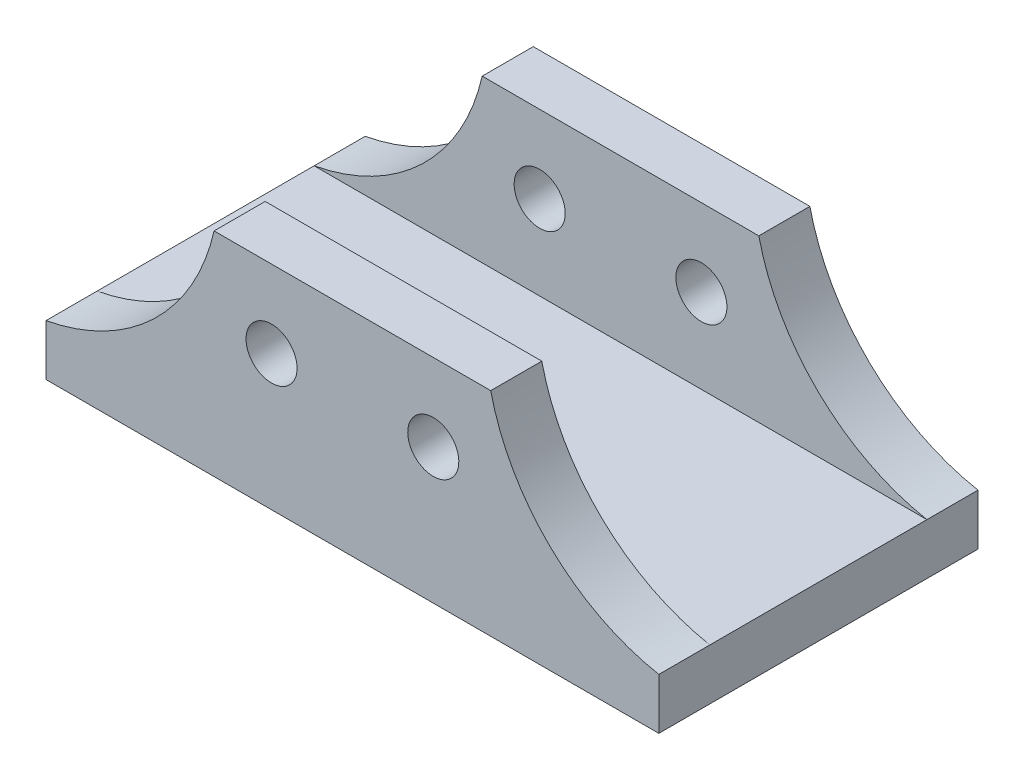
ISO-10303-21;
HEADER;
FILE_DESCRIPTION(('STEP AP214'),'2;1');
FILE_NAME('part.step','',(''),(''),'','','');
FILE_SCHEMA(('AUTOMOTIVE_DESIGN { 1 0 10303 214 1 1 1 1 }'));
ENDSEC;
DATA;
#1=APPLICATION_CONTEXT('core data for automotive mechanical design processes');
#2=APPLICATION_PROTOCOL_DEFINITION('international standard','automotive_design',2000,#1);
#3=PRODUCT_CONTEXT('',#1,'mechanical');
#4=PRODUCT('Part','Part','',(#3));
#5=PRODUCT_RELATED_PRODUCT_CATEGORY('part','',(#4));
#6=PRODUCT_DEFINITION_FORMATION('','',#4);
#7=PRODUCT_DEFINITION_CONTEXT('part definition',#1,'design');
#8=PRODUCT_DEFINITION('design','',#6,#7);
#9=PRODUCT_DEFINITION_SHAPE('','',#8);
#10=(LENGTH_UNIT() NAMED_UNIT(*) SI_UNIT(.MILLI.,.METRE.));
#11=(NAMED_UNIT(*) PLANE_ANGLE_UNIT() SI_UNIT($,.RADIAN.));
#12=(NAMED_UNIT(*) SI_UNIT($,.STERADIAN.) SOLID_ANGLE_UNIT());
#13=UNCERTAINTY_MEASURE_WITH_UNIT(LENGTH_MEASURE(1.E-05),#10,'distance_accuracy_value','');
#14=(GEOMETRIC_REPRESENTATION_CONTEXT(3) GLOBAL_UNCERTAINTY_ASSIGNED_CONTEXT((#13)) GLOBAL_UNIT_ASSIGNED_CONTEXT((#10,
#11,#12)) REPRESENTATION_CONTEXT('',''));
#15=CARTESIAN_POINT('',(0.,0.,0.));
#16=DIRECTION('',(0.,0.,1.));
#17=DIRECTION('',(1.,0.,0.));
#18=AXIS2_PLACEMENT_3D('',#15,#16,#17);
#19=CARTESIAN_POINT('',(81.2436376247931,61.1381233205086,-186.429513529052));
#20=DIRECTION('',(0.,0.,1.));
#21=DIRECTION('',(1.,0.,0.));
#22=AXIS2_PLACEMENT_3D('',#19,#20,#21);
#23=CYLINDRICAL_SURFACE('',#22,50.);
#24=CARTESIAN_POINT('',(81.2436376247931,61.1381233205086,25.5));
#25=DIRECTION('',(0.,0.,1.));
#26=DIRECTION('',(0.,-1.,0.));
#27=AXIS2_PLACEMENT_3D('',#24,#25,#26);
#28=CIRCLE('',#27,50.);
#29=CARTESIAN_POINT('',(32.4999999999999,50.,25.5));
#30=VERTEX_POINT('',#29);
#31=CARTESIAN_POINT('',(71.9999999999999,12.,25.5));
#32=VERTEX_POINT('',#31);
#33=EDGE_CURVE('E132',#30,#32,#28,.T.);
#34=ORIENTED_EDGE('',*,*,#33,.F.);
#35=DIRECTION('',(0.,0.,1.));
#36=VECTOR('',#35,1.);
#37=CARTESIAN_POINT('',(32.5,50.,-186.429513529052));
#38=LINE('',#37,#36);
#39=CARTESIAN_POINT('',(32.5,50.,37.5));
#40=VERTEX_POINT('',#39);
#41=EDGE_CURVE('E219',#30,#40,#38,.T.);
#42=ORIENTED_EDGE('',*,*,#41,.T.);
#43=CARTESIAN_POINT('',(81.2436376247931,61.1381233205086,37.5));
#44=DIRECTION('',(0.,0.,-1.));
#45=DIRECTION('',(-1.,0.,0.));
#46=AXIS2_PLACEMENT_3D('',#43,#44,#45);
#47=CIRCLE('',#46,50.);
#48=CARTESIAN_POINT('',(72.,12.,37.5));
#49=VERTEX_POINT('',#48);
#50=EDGE_CURVE('E213',#49,#40,#47,.T.);
#51=ORIENTED_EDGE('',*,*,#50,.F.);
#52=DIRECTION('',(0.,0.,-1.));
#53=VECTOR('',#52,1.);
#54=CARTESIAN_POINT('',(72.,12.,-37.5));
#55=LINE('',#54,#53);
#56=EDGE_CURVE('E151',#49,#32,#55,.T.);
#57=ORIENTED_EDGE('',*,*,#56,.T.);
#58=EDGE_LOOP('',(#34,#42,#51,#57));
#59=FACE_BOUND('',#58,.T.);
#60=ADVANCED_FACE('F33',(#59),#23,.F.);
#61=CARTESIAN_POINT('',(-32.5,50.,-186.429513529052));
#62=DIRECTION('',(0.,1.,0.));
#63=DIRECTION('',(-1.,0.,0.));
#64=AXIS2_PLACEMENT_3D('',#61,#62,#63);
#65=PLANE('',#64);
#66=DIRECTION('',(1.,0.,0.));
#67=VECTOR('',#66,1.);
#68=CARTESIAN_POINT('',(-96.,50.,25.5));
#69=LINE('',#68,#67);
#70=CARTESIAN_POINT('',(-32.5,50.,25.5));
#71=VERTEX_POINT('',#70);
#72=EDGE_CURVE('E177',#71,#30,#69,.T.);
#73=ORIENTED_EDGE('',*,*,#72,.F.);
#74=DIRECTION('',(0.,0.,1.));
#75=VECTOR('',#74,1.);
#76=CARTESIAN_POINT('',(-32.5,50.,-186.429513529052));
#77=LINE('',#76,#75);
#78=CARTESIAN_POINT('',(-32.5,50.,37.5));
#79=VERTEX_POINT('',#78);
#80=EDGE_CURVE('E221',#71,#79,#77,.T.);
#81=ORIENTED_EDGE('',*,*,#80,.T.);
#82=DIRECTION('',(-1.,0.,0.));
#83=VECTOR('',#82,1.);
#84=CARTESIAN_POINT('',(-32.5,50.,37.5));
#85=LINE('',#84,#83);
#86=EDGE_CURVE('E216',#40,#79,#85,.T.);
#87=ORIENTED_EDGE('',*,*,#86,.F.);
#88=ORIENTED_EDGE('',*,*,#41,.F.);
#89=EDGE_LOOP('',(#73,#81,#87,#88));
#90=FACE_BOUND('',#89,.T.);
#91=ADVANCED_FACE('F229',(#90),#65,.T.);
#92=CARTESIAN_POINT('',(-81.2436376247931,61.1381233205086,-186.429513529052));
#93=DIRECTION('',(0.,0.,1.));
#94=DIRECTION('',(1.,0.,0.));
#95=AXIS2_PLACEMENT_3D('',#92,#93,#94);
#96=CYLINDRICAL_SURFACE('',#95,50.);
#97=CARTESIAN_POINT('',(-81.2436376247931,61.1381233205086,25.5));
#98=DIRECTION('',(0.,0.,1.));
#99=DIRECTION('',(0.,-1.,0.));
#100=AXIS2_PLACEMENT_3D('',#97,#98,#99);
#101=CIRCLE('',#100,50.);
#102=CARTESIAN_POINT('',(-71.9999999999999,12.,25.5));
#103=VERTEX_POINT('',#102);
#104=EDGE_CURVE('E193',#103,#71,#101,.T.);
#105=ORIENTED_EDGE('',*,*,#104,.F.);
#106=DIRECTION('',(0.,0.,1.));
#107=VECTOR('',#106,1.);
#108=CARTESIAN_POINT('',(-72.,12.,-37.5));
#109=LINE('',#108,#107);
#110=CARTESIAN_POINT('',(-72.,12.,37.5));
#111=VERTEX_POINT('',#110);
#112=EDGE_CURVE('E59',#103,#111,#109,.T.);
#113=ORIENTED_EDGE('',*,*,#112,.T.);
#114=CARTESIAN_POINT('',(-81.2436376247931,61.1381233205086,37.5));
#115=DIRECTION('',(0.,0.,-1.));
#116=DIRECTION('',(1.,0.,0.));
#117=AXIS2_PLACEMENT_3D('',#114,#115,#116);
#118=CIRCLE('',#117,50.);
#119=EDGE_CURVE('E210',#79,#111,#118,.T.);
#120=ORIENTED_EDGE('',*,*,#119,.F.);
#121=ORIENTED_EDGE('',*,*,#80,.F.);
#122=EDGE_LOOP('',(#105,#113,#120,#121));
#123=FACE_BOUND('',#122,.T.);
#124=ADVANCED_FACE('F231',(#123),#96,.F.);
#125=CARTESIAN_POINT('',(-19.,31.7862398063653,-186.429513529052));
#126=DIRECTION('',(0.,0.,1.));
#127=DIRECTION('',(1.,0.,0.));
#128=AXIS2_PLACEMENT_3D('',#125,#126,#127);
#129=CYLINDRICAL_SURFACE('',#128,6.);
#130=CARTESIAN_POINT('',(-19.,31.7862398063653,25.5));
#131=DIRECTION('',(0.,0.,1.));
#132=DIRECTION('',(0.,-1.,0.));
#133=AXIS2_PLACEMENT_3D('',#130,#131,#132);
#134=CIRCLE('',#133,6.);
#135=CARTESIAN_POINT('',(-19.,25.7862398063653,25.5));
#136=VERTEX_POINT('',#135);
#137=EDGE_CURVE('E190',#136,#136,#134,.F.);
#138=ORIENTED_EDGE('',*,*,#137,.T.);
#139=EDGE_LOOP('',(#138));
#140=FACE_BOUND('',#139,.T.);
#141=CARTESIAN_POINT('',(-19.,31.7862398063653,37.5));
#142=DIRECTION('',(0.,0.,1.));
#143=DIRECTION('',(1.,0.,0.));
#144=AXIS2_PLACEMENT_3D('',#141,#142,#143);
#145=CIRCLE('',#144,6.);
#146=CARTESIAN_POINT('',(-13.,31.7862398063653,37.5));
#147=VERTEX_POINT('',#146);
#148=EDGE_CURVE('E207',#147,#147,#145,.T.);
#149=ORIENTED_EDGE('',*,*,#148,.T.);
#150=EDGE_LOOP('',(#149));
#151=FACE_BOUND('',#150,.T.);
#152=ADVANCED_FACE('F259',(#140,#151),#129,.F.);
#153=CARTESIAN_POINT('',(19.,31.7862398063653,-186.429513529052));
#154=DIRECTION('',(0.,0.,1.));
#155=DIRECTION('',(1.,0.,0.));
#156=AXIS2_PLACEMENT_3D('',#153,#154,#155);
#157=CYLINDRICAL_SURFACE('',#156,6.);
#158=CARTESIAN_POINT('',(19.,31.7862398063653,25.5));
#159=DIRECTION('',(0.,0.,1.));
#160=DIRECTION('',(0.,-1.,0.));
#161=AXIS2_PLACEMENT_3D('',#158,#159,#160);
#162=CIRCLE('',#161,6.);
#163=CARTESIAN_POINT('',(19.,25.7862398063653,25.5));
#164=VERTEX_POINT('',#163);
#165=EDGE_CURVE('E37',#164,#164,#162,.F.);
#166=ORIENTED_EDGE('',*,*,#165,.T.);
#167=EDGE_LOOP('',(#166));
#168=FACE_BOUND('',#167,.T.);
#169=CARTESIAN_POINT('',(19.,31.7862398063653,37.5));
#170=DIRECTION('',(0.,0.,1.));
#171=DIRECTION('',(-1.,0.,0.));
#172=AXIS2_PLACEMENT_3D('',#169,#170,#171);
#173=CIRCLE('',#172,6.);
#174=CARTESIAN_POINT('',(13.,31.7862398063653,37.5));
#175=VERTEX_POINT('',#174);
#176=EDGE_CURVE('E131',#175,#175,#173,.T.);
#177=ORIENTED_EDGE('',*,*,#176,.T.);
#178=EDGE_LOOP('',(#177));
#179=FACE_BOUND('',#178,.T.);
#180=ADVANCED_FACE('F262',(#168,#179),#157,.F.);
#181=CARTESIAN_POINT('',(72.,12.,-37.5));
#182=DIRECTION('',(-1.,0.,0.));
#183=DIRECTION('',(0.,0.,1.));
#184=AXIS2_PLACEMENT_3D('',#181,#182,#183);
#185=PLANE('',#184);
#186=DIRECTION('',(0.,0.,-1.));
#187=VECTOR('',#186,1.);
#188=CARTESIAN_POINT('',(72.,0.,-37.5));
#189=LINE('',#188,#187);
#190=CARTESIAN_POINT('',(72.,0.,37.5));
#191=VERTEX_POINT('',#190);
#192=CARTESIAN_POINT('',(72.,0.,-37.5));
#193=VERTEX_POINT('',#192);
#194=EDGE_CURVE('E164',#191,#193,#189,.T.);
#195=ORIENTED_EDGE('',*,*,#194,.T.);
#196=DIRECTION('',(0.,-1.,0.));
#197=VECTOR('',#196,1.);
#198=CARTESIAN_POINT('',(72.,12.,-37.5));
#199=LINE('',#198,#197);
#200=CARTESIAN_POINT('',(72.,12.,-37.5));
#201=VERTEX_POINT('',#200);
#202=EDGE_CURVE('E11',#201,#193,#199,.T.);
#203=ORIENTED_EDGE('',*,*,#202,.F.);
#204=CARTESIAN_POINT('',(71.9999999999999,12.,-25.5));
#205=VERTEX_POINT('',#204);
#206=EDGE_CURVE('E88',#205,#201,#55,.T.);
#207=ORIENTED_EDGE('',*,*,#206,.F.);
#208=DIRECTION('',(0.,0.,1.));
#209=VECTOR('',#208,1.);
#210=CARTESIAN_POINT('',(72.,12.,-186.429513529052));
#211=LINE('',#210,#209);
#212=EDGE_CURVE('E125',#32,#205,#211,.F.);
#213=ORIENTED_EDGE('',*,*,#212,.F.);
#214=ORIENTED_EDGE('',*,*,#56,.F.);
#215=DIRECTION('',(0.,-1.,0.));
#216=VECTOR('',#215,1.);
#217=CARTESIAN_POINT('',(72.,12.,37.5));
#218=LINE('',#217,#216);
#219=EDGE_CURVE('E162',#49,#191,#218,.T.);
#220=ORIENTED_EDGE('',*,*,#219,.T.);
#221=EDGE_LOOP('',(#195,#203,#207,#213,#214,#220));
#222=FACE_BOUND('',#221,.T.);
#223=ADVANCED_FACE('F35',(#222),#185,.F.);
#224=CARTESIAN_POINT('',(-72.,12.,-37.5));
#225=DIRECTION('',(0.,0.,1.));
#226=DIRECTION('',(1.,0.,0.));
#227=AXIS2_PLACEMENT_3D('',#224,#225,#226);
#228=PLANE('',#227);
#229=DIRECTION('',(-1.,0.,0.));
#230=VECTOR('',#229,1.);
#231=CARTESIAN_POINT('',(-72.,0.,-37.5));
#232=LINE('',#231,#230);
#233=CARTESIAN_POINT('',(-72.,0.,-37.5));
#234=VERTEX_POINT('',#233);
#235=EDGE_CURVE('E166',#193,#234,#232,.T.);
#236=ORIENTED_EDGE('',*,*,#235,.T.);
#237=DIRECTION('',(0.,-1.,0.));
#238=VECTOR('',#237,1.);
#239=CARTESIAN_POINT('',(-72.,12.,-37.5));
#240=LINE('',#239,#238);
#241=CARTESIAN_POINT('',(-72.,12.,-37.5));
#242=VERTEX_POINT('',#241);
#243=EDGE_CURVE('E42',#242,#234,#240,.T.);
#244=ORIENTED_EDGE('',*,*,#243,.F.);
#245=CARTESIAN_POINT('',(-81.2436376247931,61.1381233205086,-37.5));
#246=DIRECTION('',(0.,0.,1.));
#247=DIRECTION('',(1.,0.,0.));
#248=AXIS2_PLACEMENT_3D('',#245,#246,#247);
#249=CIRCLE('',#248,50.);
#250=CARTESIAN_POINT('',(-32.5,50.,-37.5));
#251=VERTEX_POINT('',#250);
#252=EDGE_CURVE('E203',#242,#251,#249,.T.);
#253=ORIENTED_EDGE('',*,*,#252,.T.);
#254=DIRECTION('',(1.,0.,0.));
#255=VECTOR('',#254,1.);
#256=CARTESIAN_POINT('',(-32.5,50.,-37.5));
#257=LINE('',#256,#255);
#258=CARTESIAN_POINT('',(32.5,50.,-37.5));
#259=VERTEX_POINT('',#258);
#260=EDGE_CURVE('E200',#251,#259,#257,.T.);
#261=ORIENTED_EDGE('',*,*,#260,.T.);
#262=CARTESIAN_POINT('',(81.2436376247931,61.1381233205086,-37.5));
#263=DIRECTION('',(0.,0.,1.));
#264=DIRECTION('',(1.,0.,0.));
#265=AXIS2_PLACEMENT_3D('',#262,#263,#264);
#266=CIRCLE('',#265,50.);
#267=EDGE_CURVE('E198',#259,#201,#266,.T.);
#268=ORIENTED_EDGE('',*,*,#267,.T.);
#269=ORIENTED_EDGE('',*,*,#202,.T.);
#270=EDGE_LOOP('',(#236,#244,#253,#261,#268,#269));
#271=FACE_BOUND('',#270,.T.);
#272=CARTESIAN_POINT('',(19.,31.7862398063653,-37.5));
#273=DIRECTION('',(0.,0.,1.));
#274=DIRECTION('',(1.,0.,0.));
#275=AXIS2_PLACEMENT_3D('',#272,#273,#274);
#276=CIRCLE('',#275,6.);
#277=CARTESIAN_POINT('',(25.,31.7862398063653,-37.5));
#278=VERTEX_POINT('',#277);
#279=EDGE_CURVE('E157',#278,#278,#276,.F.);
#280=ORIENTED_EDGE('',*,*,#279,.F.);
#281=EDGE_LOOP('',(#280));
#282=FACE_BOUND('',#281,.T.);
#283=CARTESIAN_POINT('',(-19.,31.7862398063653,-37.5));
#284=DIRECTION('',(0.,0.,1.));
#285=DIRECTION('',(1.,0.,0.));
#286=AXIS2_PLACEMENT_3D('',#283,#284,#285);
#287=CIRCLE('',#286,6.);
#288=CARTESIAN_POINT('',(-13.,31.7862398063653,-37.5));
#289=VERTEX_POINT('',#288);
#290=EDGE_CURVE('E167',#289,#289,#287,.F.);
#291=ORIENTED_EDGE('',*,*,#290,.F.);
#292=EDGE_LOOP('',(#291));
#293=FACE_BOUND('',#292,.T.);
#294=ADVANCED_FACE('F238',(#271,#282,#293),#228,.F.);
#295=CARTESIAN_POINT('',(-72.,12.,-37.5));
#296=DIRECTION('',(1.,0.,0.));
#297=DIRECTION('',(0.,0.,-1.));
#298=AXIS2_PLACEMENT_3D('',#295,#296,#297);
#299=PLANE('',#298);
#300=DIRECTION('',(0.,0.,1.));
#301=VECTOR('',#300,1.);
#302=CARTESIAN_POINT('',(-72.,0.,-37.5));
#303=LINE('',#302,#301);
#304=CARTESIAN_POINT('',(-72.,0.,37.5));
#305=VERTEX_POINT('',#304);
#306=EDGE_CURVE('E153',#234,#305,#303,.T.);
#307=ORIENTED_EDGE('',*,*,#306,.T.);
#308=DIRECTION('',(0.,-1.,0.));
#309=VECTOR('',#308,1.);
#310=CARTESIAN_POINT('',(-72.,12.,37.5));
#311=LINE('',#310,#309);
#312=EDGE_CURVE('E171',#111,#305,#311,.T.);
#313=ORIENTED_EDGE('',*,*,#312,.F.);
#314=ORIENTED_EDGE('',*,*,#112,.F.);
#315=CARTESIAN_POINT('',(-72.,12.,-25.5));
#316=VERTEX_POINT('',#315);
#317=EDGE_CURVE('E163',#316,#103,#109,.T.);
#318=ORIENTED_EDGE('',*,*,#317,.F.);
#319=EDGE_CURVE('E159',#242,#316,#109,.T.);
#320=ORIENTED_EDGE('',*,*,#319,.F.);
#321=ORIENTED_EDGE('',*,*,#243,.T.);
#322=EDGE_LOOP('',(#307,#313,#314,#318,#320,#321));
#323=FACE_BOUND('',#322,.T.);
#324=ADVANCED_FACE('F248',(#323),#299,.F.);
#325=CARTESIAN_POINT('',(-72.,12.,37.5));
#326=DIRECTION('',(0.,0.,-1.));
#327=DIRECTION('',(-1.,0.,0.));
#328=AXIS2_PLACEMENT_3D('',#325,#326,#327);
#329=PLANE('',#328);
#330=DIRECTION('',(1.,0.,0.));
#331=VECTOR('',#330,1.);
#332=CARTESIAN_POINT('',(-72.,0.,37.5));
#333=LINE('',#332,#331);
#334=EDGE_CURVE('E81',#305,#191,#333,.T.);
#335=ORIENTED_EDGE('',*,*,#334,.T.);
#336=ORIENTED_EDGE('',*,*,#219,.F.);
#337=ORIENTED_EDGE('',*,*,#50,.T.);
#338=ORIENTED_EDGE('',*,*,#86,.T.);
#339=ORIENTED_EDGE('',*,*,#119,.T.);
#340=ORIENTED_EDGE('',*,*,#312,.T.);
#341=EDGE_LOOP('',(#335,#336,#337,#338,#339,#340));
#342=FACE_BOUND('',#341,.T.);
#343=ORIENTED_EDGE('',*,*,#176,.F.);
#344=EDGE_LOOP('',(#343));
#345=FACE_BOUND('',#344,.T.);
#346=ORIENTED_EDGE('',*,*,#148,.F.);
#347=EDGE_LOOP('',(#346));
#348=FACE_BOUND('',#347,.T.);
#349=ADVANCED_FACE('F227',(#342,#345,#348),#329,.F.);
#350=CARTESIAN_POINT('',(0.,0.,0.));
#351=DIRECTION('',(0.,1.,0.));
#352=DIRECTION('',(0.,0.,1.));
#353=AXIS2_PLACEMENT_3D('',#350,#351,#352);
#354=PLANE('',#353);
#355=ORIENTED_EDGE('',*,*,#194,.F.);
#356=ORIENTED_EDGE('',*,*,#334,.F.);
#357=ORIENTED_EDGE('',*,*,#306,.F.);
#358=ORIENTED_EDGE('',*,*,#235,.F.);
#359=EDGE_LOOP('',(#355,#356,#357,#358));
#360=FACE_BOUND('',#359,.T.);
#361=ADVANCED_FACE('F236',(#360),#354,.F.);
#362=CARTESIAN_POINT('',(81.2436376247931,61.1381233205086,-25.5));
#363=DIRECTION('',(0.,0.,-1.));
#364=DIRECTION('',(-1.,0.,0.));
#365=AXIS2_PLACEMENT_3D('',#362,#363,#364);
#366=CIRCLE('',#365,50.);
#367=CARTESIAN_POINT('',(32.4999999999999,50.,-25.5));
#368=VERTEX_POINT('',#367);
#369=EDGE_CURVE('E137',#205,#368,#366,.T.);
#370=ORIENTED_EDGE('',*,*,#369,.F.);
#371=ORIENTED_EDGE('',*,*,#206,.T.);
#372=ORIENTED_EDGE('',*,*,#267,.F.);
#373=EDGE_CURVE('E147',#259,#368,#38,.T.);
#374=ORIENTED_EDGE('',*,*,#373,.T.);
#375=EDGE_LOOP('',(#370,#371,#372,#374));
#376=FACE_BOUND('',#375,.T.);
#377=ADVANCED_FACE('F145',(#376),#23,.F.);
#378=DIRECTION('',(1.,0.,0.));
#379=VECTOR('',#378,1.);
#380=CARTESIAN_POINT('',(-96.,50.,-25.5));
#381=LINE('',#380,#379);
#382=CARTESIAN_POINT('',(-32.5,50.,-25.5));
#383=VERTEX_POINT('',#382);
#384=EDGE_CURVE('E142',#383,#368,#381,.T.);
#385=ORIENTED_EDGE('',*,*,#384,.T.);
#386=ORIENTED_EDGE('',*,*,#373,.F.);
#387=ORIENTED_EDGE('',*,*,#260,.F.);
#388=EDGE_CURVE('E201',#251,#383,#77,.T.);
#389=ORIENTED_EDGE('',*,*,#388,.T.);
#390=EDGE_LOOP('',(#385,#386,#387,#389));
#391=FACE_BOUND('',#390,.T.);
#392=ADVANCED_FACE('F242',(#391),#65,.T.);
#393=CARTESIAN_POINT('',(-81.2436376247931,61.1381233205086,-25.5));
#394=DIRECTION('',(0.,0.,-1.));
#395=DIRECTION('',(-1.,0.,0.));
#396=AXIS2_PLACEMENT_3D('',#393,#394,#395);
#397=CIRCLE('',#396,50.);
#398=EDGE_CURVE('E140',#383,#316,#397,.T.);
#399=ORIENTED_EDGE('',*,*,#398,.F.);
#400=ORIENTED_EDGE('',*,*,#388,.F.);
#401=ORIENTED_EDGE('',*,*,#252,.F.);
#402=ORIENTED_EDGE('',*,*,#319,.T.);
#403=EDGE_LOOP('',(#399,#400,#401,#402));
#404=FACE_BOUND('',#403,.T.);
#405=ADVANCED_FACE('F245',(#404),#96,.F.);
#406=CARTESIAN_POINT('',(-19.,31.7862398063653,-25.5));
#407=DIRECTION('',(0.,0.,-1.));
#408=DIRECTION('',(-1.,0.,0.));
#409=AXIS2_PLACEMENT_3D('',#406,#407,#408);
#410=CIRCLE('',#409,6.);
#411=CARTESIAN_POINT('',(-25.,31.7862398063653,-25.5));
#412=VERTEX_POINT('',#411);
#413=EDGE_CURVE('E176',#412,#412,#410,.F.);
#414=ORIENTED_EDGE('',*,*,#413,.T.);
#415=EDGE_LOOP('',(#414));
#416=FACE_BOUND('',#415,.T.);
#417=ORIENTED_EDGE('',*,*,#290,.T.);
#418=EDGE_LOOP('',(#417));
#419=FACE_BOUND('',#418,.T.);
#420=ADVANCED_FACE('F264',(#416,#419),#129,.F.);
#421=CARTESIAN_POINT('',(19.,31.7862398063653,-25.5));
#422=DIRECTION('',(0.,0.,-1.));
#423=DIRECTION('',(-1.,0.,0.));
#424=AXIS2_PLACEMENT_3D('',#421,#422,#423);
#425=CIRCLE('',#424,6.);
#426=CARTESIAN_POINT('',(13.,31.7862398063653,-25.5));
#427=VERTEX_POINT('',#426);
#428=EDGE_CURVE('E174',#427,#427,#425,.F.);
#429=ORIENTED_EDGE('',*,*,#428,.T.);
#430=EDGE_LOOP('',(#429));
#431=FACE_BOUND('',#430,.T.);
#432=ORIENTED_EDGE('',*,*,#279,.T.);
#433=EDGE_LOOP('',(#432));
#434=FACE_BOUND('',#433,.T.);
#435=ADVANCED_FACE('F252',(#431,#434),#157,.F.);
#436=CARTESIAN_POINT('',(-96.,50.,25.5));
#437=DIRECTION('',(0.,0.,1.));
#438=DIRECTION('',(0.,-1.,0.));
#439=AXIS2_PLACEMENT_3D('',#436,#437,#438);
#440=PLANE('',#439);
#441=ORIENTED_EDGE('',*,*,#33,.T.);
#442=DIRECTION('',(1.,0.,0.));
#443=VECTOR('',#442,1.);
#444=CARTESIAN_POINT('',(-96.,12.,25.5));
#445=LINE('',#444,#443);
#446=EDGE_CURVE('E128',#103,#32,#445,.T.);
#447=ORIENTED_EDGE('',*,*,#446,.F.);
#448=ORIENTED_EDGE('',*,*,#104,.T.);
#449=ORIENTED_EDGE('',*,*,#72,.T.);
#450=EDGE_LOOP('',(#441,#447,#448,#449));
#451=FACE_BOUND('',#450,.T.);
#452=ORIENTED_EDGE('',*,*,#165,.F.);
#453=EDGE_LOOP('',(#452));
#454=FACE_BOUND('',#453,.T.);
#455=ORIENTED_EDGE('',*,*,#137,.F.);
#456=EDGE_LOOP('',(#455));
#457=FACE_BOUND('',#456,.T.);
#458=ADVANCED_FACE('F249',(#451,#454,#457),#440,.F.);
#459=CARTESIAN_POINT('',(-96.,50.,-25.5));
#460=DIRECTION('',(0.,0.,-1.));
#461=DIRECTION('',(-1.,0.,0.));
#462=AXIS2_PLACEMENT_3D('',#459,#460,#461);
#463=PLANE('',#462);
#464=ORIENTED_EDGE('',*,*,#369,.T.);
#465=ORIENTED_EDGE('',*,*,#384,.F.);
#466=ORIENTED_EDGE('',*,*,#398,.T.);
#467=DIRECTION('',(1.,0.,0.));
#468=VECTOR('',#467,1.);
#469=CARTESIAN_POINT('',(-96.,12.,-25.5));
#470=LINE('',#469,#468);
#471=EDGE_CURVE('E50',#316,#205,#470,.T.);
#472=ORIENTED_EDGE('',*,*,#471,.T.);
#473=EDGE_LOOP('',(#464,#465,#466,#472));
#474=FACE_BOUND('',#473,.T.);
#475=ORIENTED_EDGE('',*,*,#428,.F.);
#476=EDGE_LOOP('',(#475));
#477=FACE_BOUND('',#476,.T.);
#478=ORIENTED_EDGE('',*,*,#413,.F.);
#479=EDGE_LOOP('',(#478));
#480=FACE_BOUND('',#479,.T.);
#481=ADVANCED_FACE('F135',(#474,#477,#480),#463,.F.);
#482=CARTESIAN_POINT('',(-96.,12.,25.5));
#483=DIRECTION('',(0.,-1.,0.));
#484=DIRECTION('',(0.,0.,-1.));
#485=AXIS2_PLACEMENT_3D('',#482,#483,#484);
#486=PLANE('',#485);
#487=ORIENTED_EDGE('',*,*,#212,.T.);
#488=ORIENTED_EDGE('',*,*,#471,.F.);
#489=ORIENTED_EDGE('',*,*,#317,.T.);
#490=ORIENTED_EDGE('',*,*,#446,.T.);
#491=EDGE_LOOP('',(#487,#488,#489,#490));
#492=FACE_BOUND('',#491,.T.);
#493=ADVANCED_FACE('F126',(#492),#486,.F.);
#494=CLOSED_SHELL('',(#60,#91,#124,#152,#180,#223,#294,#324,#349,#361,#377,#392,#405,#420,#435,
#458,#481,#493));
#495=MANIFOLD_SOLID_BREP('B2',#494);
#496=ADVANCED_BREP_SHAPE_REPRESENTATION('',(#18,#495),#14);
#497=SHAPE_DEFINITION_REPRESENTATION(#9,#496);
ENDSEC;
END-ISO-10303-21;
